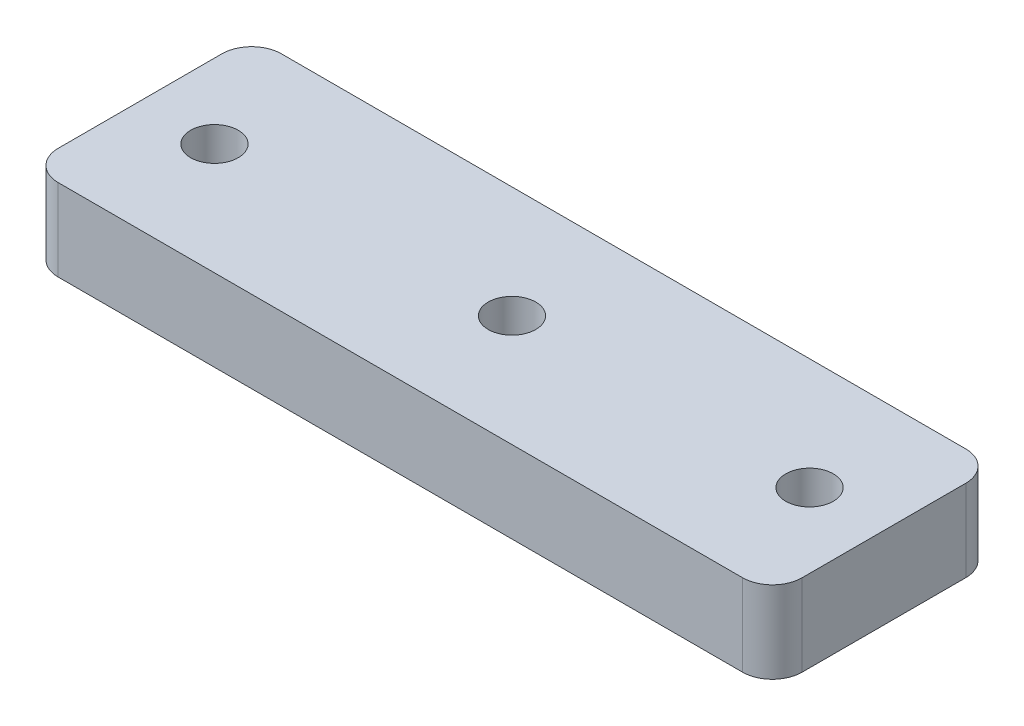
ISO-10303-21;
HEADER;
FILE_DESCRIPTION(('STEP AP214'),'2;1');
FILE_NAME('part.step','',(''),(''),'','','');
FILE_SCHEMA(('AUTOMOTIVE_DESIGN { 1 0 10303 214 1 1 1 1 }'));
ENDSEC;
DATA;
#1=APPLICATION_CONTEXT('core data for automotive mechanical design processes');
#2=APPLICATION_PROTOCOL_DEFINITION('international standard','automotive_design',2000,#1);
#3=PRODUCT_CONTEXT('',#1,'mechanical');
#4=PRODUCT('Part','Part','',(#3));
#5=PRODUCT_RELATED_PRODUCT_CATEGORY('part','',(#4));
#6=PRODUCT_DEFINITION_FORMATION('','',#4);
#7=PRODUCT_DEFINITION_CONTEXT('part definition',#1,'design');
#8=PRODUCT_DEFINITION('design','',#6,#7);
#9=PRODUCT_DEFINITION_SHAPE('','',#8);
#10=(LENGTH_UNIT() NAMED_UNIT(*) SI_UNIT(.MILLI.,.METRE.));
#11=(NAMED_UNIT(*) PLANE_ANGLE_UNIT() SI_UNIT($,.RADIAN.));
#12=(NAMED_UNIT(*) SI_UNIT($,.STERADIAN.) SOLID_ANGLE_UNIT());
#13=UNCERTAINTY_MEASURE_WITH_UNIT(LENGTH_MEASURE(1.E-05),#10,'distance_accuracy_value','');
#14=(GEOMETRIC_REPRESENTATION_CONTEXT(3) GLOBAL_UNCERTAINTY_ASSIGNED_CONTEXT((#13)) GLOBAL_UNIT_ASSIGNED_CONTEXT((#10,
#11,#12)) REPRESENTATION_CONTEXT('',''));
#15=CARTESIAN_POINT('',(0.,0.,0.));
#16=DIRECTION('',(0.,0.,1.));
#17=DIRECTION('',(1.,0.,0.));
#18=AXIS2_PLACEMENT_3D('',#15,#16,#17);
#19=CARTESIAN_POINT('',(0.,5.5,0.));
#20=DIRECTION('',(0.,-1.,0.));
#21=DIRECTION('',(0.,0.,-1.));
#22=AXIS2_PLACEMENT_3D('',#19,#20,#21);
#23=PLANE('',#22);
#24=DIRECTION('',(0.,0.,1.));
#25=VECTOR('',#24,1.);
#26=CARTESIAN_POINT('',(-25.,5.5,7.5));
#27=LINE('',#26,#25);
#28=CARTESIAN_POINT('',(-25.,5.5,-5.5));
#29=VERTEX_POINT('',#28);
#30=CARTESIAN_POINT('',(-25.,5.5,5.5));
#31=VERTEX_POINT('',#30);
#32=EDGE_CURVE('E206',#29,#31,#27,.T.);
#33=ORIENTED_EDGE('',*,*,#32,.T.);
#34=CARTESIAN_POINT('',(-23.,5.5,5.5));
#35=DIRECTION('',(0.,-1.,0.));
#36=DIRECTION('',(0.,0.,-1.));
#37=AXIS2_PLACEMENT_3D('',#34,#35,#36);
#38=CIRCLE('',#37,2.);
#39=CARTESIAN_POINT('',(-23.,5.5,7.5));
#40=VERTEX_POINT('',#39);
#41=EDGE_CURVE('E175',#31,#40,#38,.F.);
#42=ORIENTED_EDGE('',*,*,#41,.T.);
#43=DIRECTION('',(1.,0.,0.));
#44=VECTOR('',#43,1.);
#45=CARTESIAN_POINT('',(-25.,5.5,7.5));
#46=LINE('',#45,#44);
#47=CARTESIAN_POINT('',(23.,5.5,7.5));
#48=VERTEX_POINT('',#47);
#49=EDGE_CURVE('E133',#40,#48,#46,.T.);
#50=ORIENTED_EDGE('',*,*,#49,.T.);
#51=CARTESIAN_POINT('',(23.,5.5,5.5));
#52=DIRECTION('',(0.,-1.,0.));
#53=DIRECTION('',(0.,0.,-1.));
#54=AXIS2_PLACEMENT_3D('',#51,#52,#53);
#55=CIRCLE('',#54,2.);
#56=CARTESIAN_POINT('',(25.,5.5,5.5));
#57=VERTEX_POINT('',#56);
#58=EDGE_CURVE('E167',#48,#57,#55,.F.);
#59=ORIENTED_EDGE('',*,*,#58,.T.);
#60=DIRECTION('',(0.,0.,-1.));
#61=VECTOR('',#60,1.);
#62=CARTESIAN_POINT('',(25.,5.5,7.5));
#63=LINE('',#62,#61);
#64=CARTESIAN_POINT('',(25.,5.5,-5.5));
#65=VERTEX_POINT('',#64);
#66=EDGE_CURVE('E142',#57,#65,#63,.T.);
#67=ORIENTED_EDGE('',*,*,#66,.T.);
#68=CARTESIAN_POINT('',(23.,5.5,-5.5));
#69=DIRECTION('',(0.,-1.,0.));
#70=DIRECTION('',(0.,0.,-1.));
#71=AXIS2_PLACEMENT_3D('',#68,#69,#70);
#72=CIRCLE('',#71,2.);
#73=CARTESIAN_POINT('',(23.,5.5,-7.5));
#74=VERTEX_POINT('',#73);
#75=EDGE_CURVE('E68',#65,#74,#72,.F.);
#76=ORIENTED_EDGE('',*,*,#75,.T.);
#77=DIRECTION('',(-1.,0.,0.));
#78=VECTOR('',#77,1.);
#79=CARTESIAN_POINT('',(-25.,5.5,-7.5));
#80=LINE('',#79,#78);
#81=CARTESIAN_POINT('',(-23.,5.5,-7.5));
#82=VERTEX_POINT('',#81);
#83=EDGE_CURVE('E147',#74,#82,#80,.T.);
#84=ORIENTED_EDGE('',*,*,#83,.T.);
#85=CARTESIAN_POINT('',(-23.,5.5,-5.5));
#86=DIRECTION('',(0.,-1.,0.));
#87=DIRECTION('',(0.,0.,-1.));
#88=AXIS2_PLACEMENT_3D('',#85,#86,#87);
#89=CIRCLE('',#88,2.);
#90=EDGE_CURVE('E172',#82,#29,#89,.F.);
#91=ORIENTED_EDGE('',*,*,#90,.T.);
#92=EDGE_LOOP('',(#33,#42,#50,#59,#67,#76,#84,#91));
#93=FACE_BOUND('',#92,.T.);
#94=CARTESIAN_POINT('',(-20.,5.5,0.));
#95=DIRECTION('',(0.,1.,0.));
#96=DIRECTION('',(0.,0.,1.));
#97=AXIS2_PLACEMENT_3D('',#94,#95,#96);
#98=CIRCLE('',#97,1.6);
#99=CARTESIAN_POINT('',(-20.,5.5,1.6));
#100=VERTEX_POINT('',#99);
#101=EDGE_CURVE('E196',#100,#100,#98,.T.);
#102=ORIENTED_EDGE('',*,*,#101,.F.);
#103=EDGE_LOOP('',(#102));
#104=FACE_BOUND('',#103,.T.);
#105=CARTESIAN_POINT('',(0.,5.5,0.));
#106=DIRECTION('',(0.,1.,0.));
#107=DIRECTION('',(0.,0.,1.));
#108=AXIS2_PLACEMENT_3D('',#105,#106,#107);
#109=CIRCLE('',#108,1.6);
#110=CARTESIAN_POINT('',(0.,5.5,1.6));
#111=VERTEX_POINT('',#110);
#112=EDGE_CURVE('E214',#111,#111,#109,.T.);
#113=ORIENTED_EDGE('',*,*,#112,.F.);
#114=EDGE_LOOP('',(#113));
#115=FACE_BOUND('',#114,.T.);
#116=CARTESIAN_POINT('',(20.,5.5,0.));
#117=DIRECTION('',(0.,1.,0.));
#118=DIRECTION('',(0.,0.,1.));
#119=AXIS2_PLACEMENT_3D('',#116,#117,#118);
#120=CIRCLE('',#119,1.6);
#121=CARTESIAN_POINT('',(20.,5.5,1.6));
#122=VERTEX_POINT('',#121);
#123=EDGE_CURVE('E220',#122,#122,#120,.T.);
#124=ORIENTED_EDGE('',*,*,#123,.F.);
#125=EDGE_LOOP('',(#124));
#126=FACE_BOUND('',#125,.T.);
#127=ADVANCED_FACE('F45',(#93,#104,#115,#126),#23,.F.);
#128=CARTESIAN_POINT('',(0.,0.,0.));
#129=DIRECTION('',(0.,-1.,0.));
#130=DIRECTION('',(0.,0.,-1.));
#131=AXIS2_PLACEMENT_3D('',#128,#129,#130);
#132=PLANE('',#131);
#133=CARTESIAN_POINT('',(0.,0.,0.));
#134=DIRECTION('',(0.,1.,0.));
#135=DIRECTION('',(0.,0.,1.));
#136=AXIS2_PLACEMENT_3D('',#133,#134,#135);
#137=CIRCLE('',#136,1.6);
#138=CARTESIAN_POINT('',(0.,0.,1.6));
#139=VERTEX_POINT('',#138);
#140=EDGE_CURVE('E216',#139,#139,#137,.T.);
#141=ORIENTED_EDGE('',*,*,#140,.T.);
#142=EDGE_LOOP('',(#141));
#143=FACE_BOUND('',#142,.T.);
#144=DIRECTION('',(1.,0.,0.));
#145=VECTOR('',#144,1.);
#146=CARTESIAN_POINT('',(-25.,0.,7.5));
#147=LINE('',#146,#145);
#148=CARTESIAN_POINT('',(-23.,0.,7.5));
#149=VERTEX_POINT('',#148);
#150=CARTESIAN_POINT('',(23.,0.,7.5));
#151=VERTEX_POINT('',#150);
#152=EDGE_CURVE('E130',#149,#151,#147,.T.);
#153=ORIENTED_EDGE('',*,*,#152,.F.);
#154=CARTESIAN_POINT('',(-23.,0.,5.5));
#155=DIRECTION('',(0.,-1.,0.));
#156=DIRECTION('',(0.,0.,-1.));
#157=AXIS2_PLACEMENT_3D('',#154,#155,#156);
#158=CIRCLE('',#157,2.);
#159=CARTESIAN_POINT('',(-25.,0.,5.5));
#160=VERTEX_POINT('',#159);
#161=EDGE_CURVE('E112',#149,#160,#158,.T.);
#162=ORIENTED_EDGE('',*,*,#161,.T.);
#163=DIRECTION('',(0.,0.,1.));
#164=VECTOR('',#163,1.);
#165=CARTESIAN_POINT('',(-25.,0.,7.5));
#166=LINE('',#165,#164);
#167=CARTESIAN_POINT('',(-25.,0.,-5.5));
#168=VERTEX_POINT('',#167);
#169=EDGE_CURVE('E143',#168,#160,#166,.T.);
#170=ORIENTED_EDGE('',*,*,#169,.F.);
#171=CARTESIAN_POINT('',(-23.,0.,-5.5));
#172=DIRECTION('',(0.,-1.,0.));
#173=DIRECTION('',(0.,0.,-1.));
#174=AXIS2_PLACEMENT_3D('',#171,#172,#173);
#175=CIRCLE('',#174,2.);
#176=CARTESIAN_POINT('',(-23.,0.,-7.5));
#177=VERTEX_POINT('',#176);
#178=EDGE_CURVE('E124',#168,#177,#175,.T.);
#179=ORIENTED_EDGE('',*,*,#178,.T.);
#180=DIRECTION('',(-1.,0.,0.));
#181=VECTOR('',#180,1.);
#182=CARTESIAN_POINT('',(-25.,0.,-7.5));
#183=LINE('',#182,#181);
#184=CARTESIAN_POINT('',(23.,0.,-7.5));
#185=VERTEX_POINT('',#184);
#186=EDGE_CURVE('E149',#185,#177,#183,.T.);
#187=ORIENTED_EDGE('',*,*,#186,.F.);
#188=CARTESIAN_POINT('',(23.,0.,-5.5));
#189=DIRECTION('',(0.,-1.,0.));
#190=DIRECTION('',(0.,0.,-1.));
#191=AXIS2_PLACEMENT_3D('',#188,#189,#190);
#192=CIRCLE('',#191,2.);
#193=CARTESIAN_POINT('',(25.,0.,-5.5));
#194=VERTEX_POINT('',#193);
#195=EDGE_CURVE('E157',#185,#194,#192,.T.);
#196=ORIENTED_EDGE('',*,*,#195,.T.);
#197=DIRECTION('',(0.,0.,-1.));
#198=VECTOR('',#197,1.);
#199=CARTESIAN_POINT('',(25.,0.,7.5));
#200=LINE('',#199,#198);
#201=CARTESIAN_POINT('',(25.,0.,5.5));
#202=VERTEX_POINT('',#201);
#203=EDGE_CURVE('E190',#202,#194,#200,.T.);
#204=ORIENTED_EDGE('',*,*,#203,.F.);
#205=CARTESIAN_POINT('',(23.,0.,5.5));
#206=DIRECTION('',(0.,-1.,0.));
#207=DIRECTION('',(0.,0.,-1.));
#208=AXIS2_PLACEMENT_3D('',#205,#206,#207);
#209=CIRCLE('',#208,2.);
#210=EDGE_CURVE('E135',#202,#151,#209,.T.);
#211=ORIENTED_EDGE('',*,*,#210,.T.);
#212=EDGE_LOOP('',(#153,#162,#170,#179,#187,#196,#204,#211));
#213=FACE_BOUND('',#212,.T.);
#214=CARTESIAN_POINT('',(-20.,0.,0.));
#215=DIRECTION('',(0.,1.,0.));
#216=DIRECTION('',(0.,0.,1.));
#217=AXIS2_PLACEMENT_3D('',#214,#215,#216);
#218=CIRCLE('',#217,1.6);
#219=CARTESIAN_POINT('',(-20.,0.,1.6));
#220=VERTEX_POINT('',#219);
#221=EDGE_CURVE('E201',#220,#220,#218,.T.);
#222=ORIENTED_EDGE('',*,*,#221,.T.);
#223=EDGE_LOOP('',(#222));
#224=FACE_BOUND('',#223,.T.);
#225=CARTESIAN_POINT('',(20.,0.,0.));
#226=DIRECTION('',(0.,1.,0.));
#227=DIRECTION('',(0.,0.,1.));
#228=AXIS2_PLACEMENT_3D('',#225,#226,#227);
#229=CIRCLE('',#228,1.6);
#230=CARTESIAN_POINT('',(20.,0.,1.6));
#231=VERTEX_POINT('',#230);
#232=EDGE_CURVE('E224',#231,#231,#229,.T.);
#233=ORIENTED_EDGE('',*,*,#232,.T.);
#234=EDGE_LOOP('',(#233));
#235=FACE_BOUND('',#234,.T.);
#236=ADVANCED_FACE('F138',(#143,#213,#224,#235),#132,.T.);
#237=CARTESIAN_POINT('',(25.,5.5,7.5));
#238=DIRECTION('',(-1.,0.,0.));
#239=DIRECTION('',(0.,0.,1.));
#240=AXIS2_PLACEMENT_3D('',#237,#238,#239);
#241=PLANE('',#240);
#242=ORIENTED_EDGE('',*,*,#203,.T.);
#243=DIRECTION('',(0.,-1.,0.));
#244=VECTOR('',#243,1.);
#245=CARTESIAN_POINT('',(25.,5.5,-5.5));
#246=LINE('',#245,#244);
#247=EDGE_CURVE('E11',#194,#65,#246,.F.);
#248=ORIENTED_EDGE('',*,*,#247,.T.);
#249=ORIENTED_EDGE('',*,*,#66,.F.);
#250=DIRECTION('',(0.,-1.,0.));
#251=VECTOR('',#250,1.);
#252=CARTESIAN_POINT('',(25.,5.5,5.5));
#253=LINE('',#252,#251);
#254=EDGE_CURVE('E54',#57,#202,#253,.T.);
#255=ORIENTED_EDGE('',*,*,#254,.T.);
#256=EDGE_LOOP('',(#242,#248,#249,#255));
#257=FACE_BOUND('',#256,.T.);
#258=ADVANCED_FACE('F189',(#257),#241,.F.);
#259=CARTESIAN_POINT('',(-25.,5.5,-7.5));
#260=DIRECTION('',(0.,0.,1.));
#261=DIRECTION('',(1.,0.,0.));
#262=AXIS2_PLACEMENT_3D('',#259,#260,#261);
#263=PLANE('',#262);
#264=ORIENTED_EDGE('',*,*,#186,.T.);
#265=DIRECTION('',(0.,-1.,0.));
#266=VECTOR('',#265,1.);
#267=CARTESIAN_POINT('',(-23.,5.5,-7.5));
#268=LINE('',#267,#266);
#269=EDGE_CURVE('E61',#177,#82,#268,.F.);
#270=ORIENTED_EDGE('',*,*,#269,.T.);
#271=ORIENTED_EDGE('',*,*,#83,.F.);
#272=DIRECTION('',(0.,-1.,0.));
#273=VECTOR('',#272,1.);
#274=CARTESIAN_POINT('',(23.,5.5,-7.5));
#275=LINE('',#274,#273);
#276=EDGE_CURVE('E178',#74,#185,#275,.T.);
#277=ORIENTED_EDGE('',*,*,#276,.T.);
#278=EDGE_LOOP('',(#264,#270,#271,#277));
#279=FACE_BOUND('',#278,.T.);
#280=ADVANCED_FACE('F253',(#279),#263,.F.);
#281=CARTESIAN_POINT('',(-25.,5.5,7.5));
#282=DIRECTION('',(1.,0.,0.));
#283=DIRECTION('',(0.,0.,-1.));
#284=AXIS2_PLACEMENT_3D('',#281,#282,#283);
#285=PLANE('',#284);
#286=ORIENTED_EDGE('',*,*,#169,.T.);
#287=DIRECTION('',(0.,-1.,0.));
#288=VECTOR('',#287,1.);
#289=CARTESIAN_POINT('',(-25.,5.5,5.5));
#290=LINE('',#289,#288);
#291=EDGE_CURVE('E117',#160,#31,#290,.F.);
#292=ORIENTED_EDGE('',*,*,#291,.T.);
#293=ORIENTED_EDGE('',*,*,#32,.F.);
#294=DIRECTION('',(0.,-1.,0.));
#295=VECTOR('',#294,1.);
#296=CARTESIAN_POINT('',(-25.,5.5,-5.5));
#297=LINE('',#296,#295);
#298=EDGE_CURVE('E123',#29,#168,#297,.T.);
#299=ORIENTED_EDGE('',*,*,#298,.T.);
#300=EDGE_LOOP('',(#286,#292,#293,#299));
#301=FACE_BOUND('',#300,.T.);
#302=ADVANCED_FACE('F250',(#301),#285,.F.);
#303=CARTESIAN_POINT('',(-25.,5.5,7.5));
#304=DIRECTION('',(0.,0.,-1.));
#305=DIRECTION('',(-1.,0.,0.));
#306=AXIS2_PLACEMENT_3D('',#303,#304,#305);
#307=PLANE('',#306);
#308=ORIENTED_EDGE('',*,*,#49,.F.);
#309=DIRECTION('',(0.,-1.,0.));
#310=VECTOR('',#309,1.);
#311=CARTESIAN_POINT('',(-23.,5.5,7.5));
#312=LINE('',#311,#310);
#313=EDGE_CURVE('E116',#40,#149,#312,.T.);
#314=ORIENTED_EDGE('',*,*,#313,.T.);
#315=ORIENTED_EDGE('',*,*,#152,.T.);
#316=DIRECTION('',(0.,-1.,0.));
#317=VECTOR('',#316,1.);
#318=CARTESIAN_POINT('',(23.,5.5,7.5));
#319=LINE('',#318,#317);
#320=EDGE_CURVE('E136',#151,#48,#319,.F.);
#321=ORIENTED_EDGE('',*,*,#320,.T.);
#322=EDGE_LOOP('',(#308,#314,#315,#321));
#323=FACE_BOUND('',#322,.T.);
#324=ADVANCED_FACE('F129',(#323),#307,.F.);
#325=CARTESIAN_POINT('',(-20.,5.5,0.));
#326=DIRECTION('',(0.,-1.,0.));
#327=DIRECTION('',(0.,0.,-1.));
#328=AXIS2_PLACEMENT_3D('',#325,#326,#327);
#329=CYLINDRICAL_SURFACE('',#328,1.6);
#330=ORIENTED_EDGE('',*,*,#101,.T.);
#331=EDGE_LOOP('',(#330));
#332=FACE_BOUND('',#331,.T.);
#333=ORIENTED_EDGE('',*,*,#221,.F.);
#334=EDGE_LOOP('',(#333));
#335=FACE_BOUND('',#334,.T.);
#336=ADVANCED_FACE('F245',(#332,#335),#329,.F.);
#337=CARTESIAN_POINT('',(0.,5.5,0.));
#338=DIRECTION('',(0.,-1.,0.));
#339=DIRECTION('',(0.,0.,-1.));
#340=AXIS2_PLACEMENT_3D('',#337,#338,#339);
#341=CYLINDRICAL_SURFACE('',#340,1.6);
#342=ORIENTED_EDGE('',*,*,#112,.T.);
#343=EDGE_LOOP('',(#342));
#344=FACE_BOUND('',#343,.T.);
#345=ORIENTED_EDGE('',*,*,#140,.F.);
#346=EDGE_LOOP('',(#345));
#347=FACE_BOUND('',#346,.T.);
#348=ADVANCED_FACE('F301',(#344,#347),#341,.F.);
#349=CARTESIAN_POINT('',(20.,5.5,0.));
#350=DIRECTION('',(0.,-1.,0.));
#351=DIRECTION('',(0.,0.,-1.));
#352=AXIS2_PLACEMENT_3D('',#349,#350,#351);
#353=CYLINDRICAL_SURFACE('',#352,1.6);
#354=ORIENTED_EDGE('',*,*,#123,.T.);
#355=EDGE_LOOP('',(#354));
#356=FACE_BOUND('',#355,.T.);
#357=ORIENTED_EDGE('',*,*,#232,.F.);
#358=EDGE_LOOP('',(#357));
#359=FACE_BOUND('',#358,.T.);
#360=ADVANCED_FACE('F232',(#356,#359),#353,.F.);
#361=CARTESIAN_POINT('',(-23.,5.5,5.5));
#362=DIRECTION('',(0.,-1.,0.));
#363=DIRECTION('',(0.,0.,-1.));
#364=AXIS2_PLACEMENT_3D('',#361,#362,#363);
#365=CYLINDRICAL_SURFACE('',#364,2.);
#366=ORIENTED_EDGE('',*,*,#41,.F.);
#367=ORIENTED_EDGE('',*,*,#291,.F.);
#368=ORIENTED_EDGE('',*,*,#161,.F.);
#369=ORIENTED_EDGE('',*,*,#313,.F.);
#370=EDGE_LOOP('',(#366,#367,#368,#369));
#371=FACE_BOUND('',#370,.T.);
#372=ADVANCED_FACE('F115',(#371),#365,.T.);
#373=CARTESIAN_POINT('',(-23.,5.5,-5.5));
#374=DIRECTION('',(0.,-1.,0.));
#375=DIRECTION('',(0.,0.,-1.));
#376=AXIS2_PLACEMENT_3D('',#373,#374,#375);
#377=CYLINDRICAL_SURFACE('',#376,2.);
#378=ORIENTED_EDGE('',*,*,#90,.F.);
#379=ORIENTED_EDGE('',*,*,#269,.F.);
#380=ORIENTED_EDGE('',*,*,#178,.F.);
#381=ORIENTED_EDGE('',*,*,#298,.F.);
#382=EDGE_LOOP('',(#378,#379,#380,#381));
#383=FACE_BOUND('',#382,.T.);
#384=ADVANCED_FACE('F261',(#383),#377,.T.);
#385=CARTESIAN_POINT('',(23.,5.5,-5.5));
#386=DIRECTION('',(0.,-1.,0.));
#387=DIRECTION('',(0.,0.,-1.));
#388=AXIS2_PLACEMENT_3D('',#385,#386,#387);
#389=CYLINDRICAL_SURFACE('',#388,2.);
#390=ORIENTED_EDGE('',*,*,#75,.F.);
#391=ORIENTED_EDGE('',*,*,#247,.F.);
#392=ORIENTED_EDGE('',*,*,#195,.F.);
#393=ORIENTED_EDGE('',*,*,#276,.F.);
#394=EDGE_LOOP('',(#390,#391,#392,#393));
#395=FACE_BOUND('',#394,.T.);
#396=ADVANCED_FACE('F263',(#395),#389,.T.);
#397=CARTESIAN_POINT('',(23.,5.5,5.5));
#398=DIRECTION('',(0.,-1.,0.));
#399=DIRECTION('',(0.,0.,-1.));
#400=AXIS2_PLACEMENT_3D('',#397,#398,#399);
#401=CYLINDRICAL_SURFACE('',#400,2.);
#402=ORIENTED_EDGE('',*,*,#58,.F.);
#403=ORIENTED_EDGE('',*,*,#320,.F.);
#404=ORIENTED_EDGE('',*,*,#210,.F.);
#405=ORIENTED_EDGE('',*,*,#254,.F.);
#406=EDGE_LOOP('',(#402,#403,#404,#405));
#407=FACE_BOUND('',#406,.T.);
#408=ADVANCED_FACE('F47',(#407),#401,.T.);
#409=CLOSED_SHELL('',(#127,#236,#258,#280,#302,#324,#336,#348,#360,#372,#384,#396,#408));
#410=MANIFOLD_SOLID_BREP('B2',#409);
#411=ADVANCED_BREP_SHAPE_REPRESENTATION('',(#18,#410),#14);
#412=SHAPE_DEFINITION_REPRESENTATION(#9,#411);
ENDSEC;
END-ISO-10303-21;
